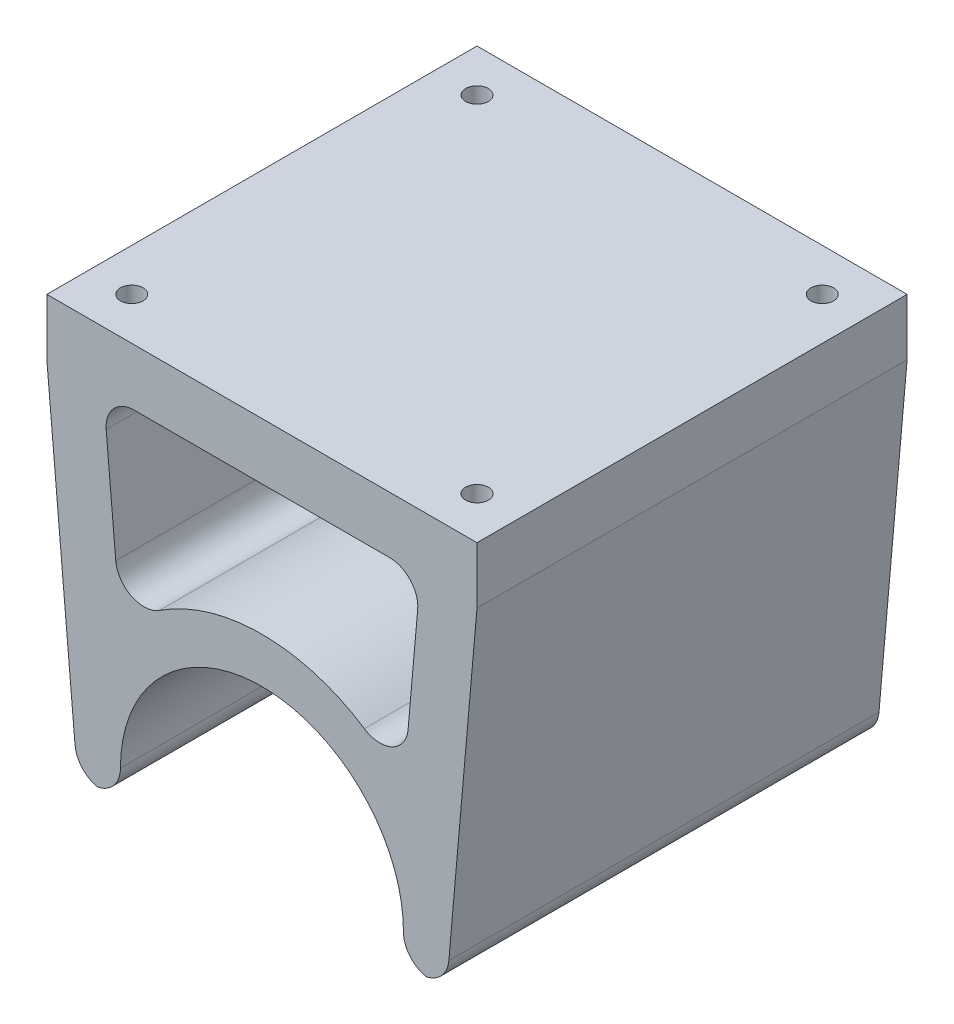
ISO-10303-21;
HEADER;
FILE_DESCRIPTION(('STEP AP214'),'2;1');
FILE_NAME('part.step','',(''),(''),'','','');
FILE_SCHEMA(('AUTOMOTIVE_DESIGN { 1 0 10303 214 1 1 1 1 }'));
ENDSEC;
DATA;
#1=APPLICATION_CONTEXT('core data for automotive mechanical design processes');
#2=APPLICATION_PROTOCOL_DEFINITION('international standard','automotive_design',2000,#1);
#3=PRODUCT_CONTEXT('',#1,'mechanical');
#4=PRODUCT('Part','Part','',(#3));
#5=PRODUCT_RELATED_PRODUCT_CATEGORY('part','',(#4));
#6=PRODUCT_DEFINITION_FORMATION('','',#4);
#7=PRODUCT_DEFINITION_CONTEXT('part definition',#1,'design');
#8=PRODUCT_DEFINITION('design','',#6,#7);
#9=PRODUCT_DEFINITION_SHAPE('','',#8);
#10=(LENGTH_UNIT() NAMED_UNIT(*) SI_UNIT(.MILLI.,.METRE.));
#11=(NAMED_UNIT(*) PLANE_ANGLE_UNIT() SI_UNIT($,.RADIAN.));
#12=(NAMED_UNIT(*) SI_UNIT($,.STERADIAN.) SOLID_ANGLE_UNIT());
#13=UNCERTAINTY_MEASURE_WITH_UNIT(LENGTH_MEASURE(1.E-05),#10,'distance_accuracy_value','');
#14=(GEOMETRIC_REPRESENTATION_CONTEXT(3) GLOBAL_UNCERTAINTY_ASSIGNED_CONTEXT((#13)) GLOBAL_UNIT_ASSIGNED_CONTEXT((#10,
#11,#12)) REPRESENTATION_CONTEXT('',''));
#15=CARTESIAN_POINT('',(0.,0.,0.));
#16=DIRECTION('',(0.,0.,1.));
#17=DIRECTION('',(1.,0.,0.));
#18=AXIS2_PLACEMENT_3D('',#15,#16,#17);
#19=CARTESIAN_POINT('',(0.,-28.,57.0788655293196));
#20=DIRECTION('',(0.,0.,-1.));
#21=DIRECTION('',(-1.,0.,0.));
#22=AXIS2_PLACEMENT_3D('',#19,#20,#21);
#23=CYLINDRICAL_SURFACE('',#22,16.5);
#24=CARTESIAN_POINT('',(0.,-28.,19.));
#25=DIRECTION('',(0.,0.,-1.));
#26=DIRECTION('',(-1.,0.,0.));
#27=AXIS2_PLACEMENT_3D('',#24,#25,#26);
#28=CIRCLE('',#27,16.5);
#29=CARTESIAN_POINT('',(-9.05046076724547,-14.2036541105787,19.));
#30=VERTEX_POINT('',#29);
#31=CARTESIAN_POINT('',(9.05046076724548,-14.2036541105787,19.));
#32=VERTEX_POINT('',#31);
#33=EDGE_CURVE('E359',#30,#32,#28,.T.);
#34=ORIENTED_EDGE('',*,*,#33,.T.);
#35=DIRECTION('',(0.,0.,-1.));
#36=VECTOR('',#35,1.);
#37=CARTESIAN_POINT('',(9.05046076724548,-14.2036541105787,57.0788655293196));
#38=LINE('',#37,#36);
#39=CARTESIAN_POINT('',(9.05046076724548,-14.2036541105787,-19.));
#40=VERTEX_POINT('',#39);
#41=EDGE_CURVE('E241',#32,#40,#38,.T.);
#42=ORIENTED_EDGE('',*,*,#41,.T.);
#43=CARTESIAN_POINT('',(0.,-28.,-19.));
#44=DIRECTION('',(0.,0.,1.));
#45=DIRECTION('',(1.,0.,0.));
#46=AXIS2_PLACEMENT_3D('',#43,#44,#45);
#47=CIRCLE('',#46,16.5);
#48=CARTESIAN_POINT('',(-9.05046076724547,-14.2036541105787,-19.));
#49=VERTEX_POINT('',#48);
#50=EDGE_CURVE('E352',#40,#49,#47,.T.);
#51=ORIENTED_EDGE('',*,*,#50,.T.);
#52=DIRECTION('',(0.,0.,-1.));
#53=VECTOR('',#52,1.);
#54=CARTESIAN_POINT('',(-9.05046076724547,-14.2036541105787,57.0788655293196));
#55=LINE('',#54,#53);
#56=EDGE_CURVE('E238',#49,#30,#55,.F.);
#57=ORIENTED_EDGE('',*,*,#56,.T.);
#58=EDGE_LOOP('',(#34,#42,#51,#57));
#59=FACE_BOUND('',#58,.T.);
#60=ADVANCED_FACE('F39',(#59),#23,.T.);
#61=CARTESIAN_POINT('',(-19.4376588699407,4.96139284015418,-50.1886965367356));
#62=DIRECTION('',(-0.996131802539622,-0.0878716789936535,0.));
#63=DIRECTION('',(0.0878716789936535,-0.996131802539622,0.));
#64=AXIS2_PLACEMENT_3D('',#61,#62,#63);
#65=PLANE('',#64);
#66=DIRECTION('',(-0.0878716789936535,0.996131802539622,0.));
#67=VECTOR('',#66,1.);
#68=CARTESIAN_POINT('',(-19.4376588699407,4.96139284015418,-19.));
#69=LINE('',#68,#67);
#70=CARTESIAN_POINT('',(-16.5106601501697,-28.2196791974841,-19.));
#71=VERTEX_POINT('',#70);
#72=CARTESIAN_POINT('',(-19.,0.,-19.));
#73=VERTEX_POINT('',#72);
#74=EDGE_CURVE('E277',#71,#73,#69,.T.);
#75=ORIENTED_EDGE('',*,*,#74,.F.);
#76=DIRECTION('',(0.,0.,-1.));
#77=VECTOR('',#76,1.);
#78=CARTESIAN_POINT('',(-16.5106601501697,-28.2196791974841,19.));
#79=LINE('',#78,#77);
#80=CARTESIAN_POINT('',(-16.5106601501697,-28.2196791974841,19.));
#81=VERTEX_POINT('',#80);
#82=EDGE_CURVE('E233',#71,#81,#79,.F.);
#83=ORIENTED_EDGE('',*,*,#82,.T.);
#84=DIRECTION('',(0.0878716789936535,-0.996131802539622,0.));
#85=VECTOR('',#84,1.);
#86=CARTESIAN_POINT('',(-19.4376588699407,4.96139284015418,19.));
#87=LINE('',#86,#85);
#88=CARTESIAN_POINT('',(-19.,0.,19.));
#89=VERTEX_POINT('',#88);
#90=EDGE_CURVE('E296',#89,#81,#87,.T.);
#91=ORIENTED_EDGE('',*,*,#90,.F.);
#92=DIRECTION('',(0.,0.,1.));
#93=VECTOR('',#92,1.);
#94=CARTESIAN_POINT('',(-19.,0.,-19.));
#95=LINE('',#94,#93);
#96=EDGE_CURVE('E286',#73,#89,#95,.T.);
#97=ORIENTED_EDGE('',*,*,#96,.F.);
#98=EDGE_LOOP('',(#75,#83,#91,#97));
#99=FACE_BOUND('',#98,.T.);
#100=ADVANCED_FACE('F282',(#99),#65,.T.);
#101=CARTESIAN_POINT('',(0.,0.,0.));
#102=DIRECTION('',(0.,1.,0.));
#103=DIRECTION('',(0.,0.,1.));
#104=AXIS2_PLACEMENT_3D('',#101,#102,#103);
#105=PLANE('',#104);
#106=DIRECTION('',(-1.,0.,0.));
#107=VECTOR('',#106,1.);
#108=CARTESIAN_POINT('',(-19.,0.,-19.));
#109=LINE('',#108,#107);
#110=CARTESIAN_POINT('',(11.2697596938976,0.,-19.));
#111=VERTEX_POINT('',#110);
#112=CARTESIAN_POINT('',(-11.2697596938976,0.,-19.));
#113=VERTEX_POINT('',#112);
#114=EDGE_CURVE('E178',#111,#113,#109,.T.);
#115=ORIENTED_EDGE('',*,*,#114,.F.);
#116=DIRECTION('',(0.,0.,1.));
#117=VECTOR('',#116,1.);
#118=CARTESIAN_POINT('',(11.2697596938976,0.,19.));
#119=LINE('',#118,#117);
#120=CARTESIAN_POINT('',(11.2697596938976,0.,19.));
#121=VERTEX_POINT('',#120);
#122=EDGE_CURVE('E249',#111,#121,#119,.T.);
#123=ORIENTED_EDGE('',*,*,#122,.T.);
#124=DIRECTION('',(1.,0.,0.));
#125=VECTOR('',#124,1.);
#126=CARTESIAN_POINT('',(-19.,0.,19.));
#127=LINE('',#126,#125);
#128=CARTESIAN_POINT('',(-11.2697596938976,0.,19.));
#129=VERTEX_POINT('',#128);
#130=EDGE_CURVE('E202',#129,#121,#127,.T.);
#131=ORIENTED_EDGE('',*,*,#130,.F.);
#132=DIRECTION('',(0.,0.,1.));
#133=VECTOR('',#132,1.);
#134=CARTESIAN_POINT('',(-11.2697596938976,0.,0.));
#135=LINE('',#134,#133);
#136=EDGE_CURVE('E247',#129,#113,#135,.F.);
#137=ORIENTED_EDGE('',*,*,#136,.T.);
#138=EDGE_LOOP('',(#115,#123,#131,#137));
#139=FACE_BOUND('',#138,.T.);
#140=ADVANCED_FACE('F337',(#139),#105,.F.);
#141=CARTESIAN_POINT('',(19.,5.,-19.));
#142=DIRECTION('',(-1.,0.,0.));
#143=DIRECTION('',(0.,0.,1.));
#144=AXIS2_PLACEMENT_3D('',#141,#142,#143);
#145=PLANE('',#144);
#146=DIRECTION('',(0.,0.,-1.));
#147=VECTOR('',#146,1.);
#148=CARTESIAN_POINT('',(19.,0.,-19.));
#149=LINE('',#148,#147);
#150=CARTESIAN_POINT('',(19.,0.,19.));
#151=VERTEX_POINT('',#150);
#152=CARTESIAN_POINT('',(19.,0.,-19.));
#153=VERTEX_POINT('',#152);
#154=EDGE_CURVE('E168',#151,#153,#149,.T.);
#155=ORIENTED_EDGE('',*,*,#154,.T.);
#156=DIRECTION('',(0.,-1.,0.));
#157=VECTOR('',#156,1.);
#158=CARTESIAN_POINT('',(19.,5.,-19.));
#159=LINE('',#158,#157);
#160=CARTESIAN_POINT('',(19.,5.,-19.));
#161=VERTEX_POINT('',#160);
#162=EDGE_CURVE('E209',#161,#153,#159,.T.);
#163=ORIENTED_EDGE('',*,*,#162,.F.);
#164=DIRECTION('',(0.,0.,-1.));
#165=VECTOR('',#164,1.);
#166=CARTESIAN_POINT('',(19.,5.,-19.));
#167=LINE('',#166,#165);
#168=CARTESIAN_POINT('',(19.,5.,19.));
#169=VERTEX_POINT('',#168);
#170=EDGE_CURVE('E193',#169,#161,#167,.T.);
#171=ORIENTED_EDGE('',*,*,#170,.F.);
#172=DIRECTION('',(0.,-1.,0.));
#173=VECTOR('',#172,1.);
#174=CARTESIAN_POINT('',(19.,5.,19.));
#175=LINE('',#174,#173);
#176=EDGE_CURVE('E184',#169,#151,#175,.T.);
#177=ORIENTED_EDGE('',*,*,#176,.T.);
#178=EDGE_LOOP('',(#155,#163,#171,#177));
#179=FACE_BOUND('',#178,.T.);
#180=ADVANCED_FACE('F191',(#179),#145,.F.);
#181=CARTESIAN_POINT('',(-19.,5.,-19.));
#182=DIRECTION('',(0.,0.,1.));
#183=DIRECTION('',(1.,0.,0.));
#184=AXIS2_PLACEMENT_3D('',#181,#182,#183);
#185=PLANE('',#184);
#186=DIRECTION('',(-0.0878716789936535,-0.996131802539622,0.));
#187=VECTOR('',#186,1.);
#188=CARTESIAN_POINT('',(14.1828516149583,2.07284429854586,-19.));
#189=LINE('',#188,#187);
#190=CARTESIAN_POINT('',(13.7600892002466,-2.71967919748414,-19.));
#191=VERTEX_POINT('',#190);
#192=CARTESIAN_POINT('',(12.9120722080257,-12.3329778702718,-19.));
#193=VERTEX_POINT('',#192);
#194=EDGE_CURVE('E366',#191,#193,#189,.T.);
#195=ORIENTED_EDGE('',*,*,#194,.F.);
#196=CARTESIAN_POINT('',(11.2697596938976,-2.5,-19.));
#197=DIRECTION('',(0.,0.,1.));
#198=DIRECTION('',(1.,0.,0.));
#199=AXIS2_PLACEMENT_3D('',#196,#197,#198);
#200=CIRCLE('',#199,2.5);
#201=EDGE_CURVE('E263',#191,#111,#200,.T.);
#202=ORIENTED_EDGE('',*,*,#201,.T.);
#203=ORIENTED_EDGE('',*,*,#114,.T.);
#204=CARTESIAN_POINT('',(-11.2697596938976,-2.5,-19.));
#205=DIRECTION('',(0.,0.,1.));
#206=DIRECTION('',(1.,0.,0.));
#207=AXIS2_PLACEMENT_3D('',#204,#205,#206);
#208=CIRCLE('',#207,2.5);
#209=CARTESIAN_POINT('',(-13.7600892002466,-2.71967919748413,-19.));
#210=VERTEX_POINT('',#209);
#211=EDGE_CURVE('E11',#113,#210,#208,.T.);
#212=ORIENTED_EDGE('',*,*,#211,.T.);
#213=DIRECTION('',(0.0878716789936535,-0.996131802539622,0.));
#214=VECTOR('',#213,1.);
#215=CARTESIAN_POINT('',(-14.4762660297865,5.39905171009484,-19.));
#216=LINE('',#215,#214);
#217=CARTESIAN_POINT('',(-12.9120722080257,-12.3329778702718,-19.));
#218=VERTEX_POINT('',#217);
#219=EDGE_CURVE('E288',#210,#218,#216,.T.);
#220=ORIENTED_EDGE('',*,*,#219,.T.);
#221=CARTESIAN_POINT('',(-10.4217427016766,-12.1132986727877,-19.));
#222=DIRECTION('',(0.,0.,1.));
#223=DIRECTION('',(1.,0.,0.));
#224=AXIS2_PLACEMENT_3D('',#221,#222,#223);
#225=CIRCLE('',#224,2.5);
#226=EDGE_CURVE('E258',#218,#49,#225,.T.);
#227=ORIENTED_EDGE('',*,*,#226,.T.);
#228=ORIENTED_EDGE('',*,*,#50,.F.);
#229=CARTESIAN_POINT('',(10.4217427016766,-12.1132986727877,-19.));
#230=DIRECTION('',(0.,0.,1.));
#231=DIRECTION('',(1.,0.,0.));
#232=AXIS2_PLACEMENT_3D('',#229,#230,#231);
#233=CIRCLE('',#232,2.5);
#234=EDGE_CURVE('E253',#40,#193,#233,.T.);
#235=ORIENTED_EDGE('',*,*,#234,.T.);
#236=EDGE_LOOP('',(#195,#202,#203,#212,#220,#227,#228,#235));
#237=FACE_BOUND('',#236,.T.);
#238=DIRECTION('',(0.0878716789936535,0.996131802539622,0.));
#239=VECTOR('',#238,1.);
#240=CARTESIAN_POINT('',(19.1442444551124,1.6351854286052,-19.));
#241=LINE('',#240,#239);
#242=CARTESIAN_POINT('',(16.5106601501697,-28.2196791974841,-19.));
#243=VERTEX_POINT('',#242);
#244=EDGE_CURVE('E173',#243,#153,#241,.T.);
#245=ORIENTED_EDGE('',*,*,#244,.F.);
#246=CARTESIAN_POINT('',(14.0203306438206,-28.,-19.));
#247=DIRECTION('',(0.,0.,1.));
#248=DIRECTION('',(1.,0.,0.));
#249=AXIS2_PLACEMENT_3D('',#246,#247,#248);
#250=CIRCLE('',#249,2.5);
#251=CARTESIAN_POINT('',(14.5101653219103,-30.4515427771387,-19.));
#252=VERTEX_POINT('',#251);
#253=EDGE_CURVE('E217',#243,#252,#250,.F.);
#254=ORIENTED_EDGE('',*,*,#253,.T.);
#255=CARTESIAN_POINT('',(15.,-28.,-19.));
#256=DIRECTION('',(0.,0.,1.));
#257=DIRECTION('',(1.,0.,0.));
#258=AXIS2_PLACEMENT_3D('',#255,#256,#257);
#259=CIRCLE('',#258,2.5);
#260=CARTESIAN_POINT('',(12.5,-28.,-19.));
#261=VERTEX_POINT('',#260);
#262=EDGE_CURVE('E220',#252,#261,#259,.F.);
#263=ORIENTED_EDGE('',*,*,#262,.T.);
#264=CARTESIAN_POINT('',(0.,-28.,-19.));
#265=DIRECTION('',(0.,0.,1.));
#266=DIRECTION('',(1.,0.,0.));
#267=AXIS2_PLACEMENT_3D('',#264,#265,#266);
#268=CIRCLE('',#267,12.5);
#269=CARTESIAN_POINT('',(-12.5,-28.,-19.));
#270=VERTEX_POINT('',#269);
#271=EDGE_CURVE('E363',#261,#270,#268,.T.);
#272=ORIENTED_EDGE('',*,*,#271,.T.);
#273=CARTESIAN_POINT('',(-15.,-28.,-19.));
#274=DIRECTION('',(0.,0.,1.));
#275=DIRECTION('',(1.,0.,0.));
#276=AXIS2_PLACEMENT_3D('',#273,#274,#275);
#277=CIRCLE('',#276,2.5);
#278=CARTESIAN_POINT('',(-14.5101653219103,-30.4515427771387,-19.));
#279=VERTEX_POINT('',#278);
#280=EDGE_CURVE('E212',#270,#279,#277,.F.);
#281=ORIENTED_EDGE('',*,*,#280,.T.);
#282=CARTESIAN_POINT('',(-14.0203306438206,-28.,-19.));
#283=DIRECTION('',(0.,0.,1.));
#284=DIRECTION('',(1.,0.,0.));
#285=AXIS2_PLACEMENT_3D('',#282,#283,#284);
#286=CIRCLE('',#285,2.5);
#287=EDGE_CURVE('E215',#279,#71,#286,.F.);
#288=ORIENTED_EDGE('',*,*,#287,.T.);
#289=ORIENTED_EDGE('',*,*,#74,.T.);
#290=DIRECTION('',(0.,-1.,0.));
#291=VECTOR('',#290,1.);
#292=CARTESIAN_POINT('',(-19.,5.,-19.));
#293=LINE('',#292,#291);
#294=CARTESIAN_POINT('',(-19.,5.,-19.));
#295=VERTEX_POINT('',#294);
#296=EDGE_CURVE('E197',#295,#73,#293,.T.);
#297=ORIENTED_EDGE('',*,*,#296,.F.);
#298=DIRECTION('',(-1.,0.,0.));
#299=VECTOR('',#298,1.);
#300=CARTESIAN_POINT('',(-19.,5.,-19.));
#301=LINE('',#300,#299);
#302=EDGE_CURVE('E325',#161,#295,#301,.T.);
#303=ORIENTED_EDGE('',*,*,#302,.F.);
#304=ORIENTED_EDGE('',*,*,#162,.T.);
#305=EDGE_LOOP('',(#245,#254,#263,#272,#281,#288,#289,#297,#303,#304));
#306=FACE_BOUND('',#305,.T.);
#307=ADVANCED_FACE('F280',(#237,#306),#185,.F.);
#308=CARTESIAN_POINT('',(-19.,5.,-19.));
#309=DIRECTION('',(1.,0.,0.));
#310=DIRECTION('',(0.,0.,-1.));
#311=AXIS2_PLACEMENT_3D('',#308,#309,#310);
#312=PLANE('',#311);
#313=ORIENTED_EDGE('',*,*,#96,.T.);
#314=DIRECTION('',(0.,-1.,0.));
#315=VECTOR('',#314,1.);
#316=CARTESIAN_POINT('',(-19.,5.,19.));
#317=LINE('',#316,#315);
#318=CARTESIAN_POINT('',(-19.,5.,19.));
#319=VERTEX_POINT('',#318);
#320=EDGE_CURVE('E192',#319,#89,#317,.T.);
#321=ORIENTED_EDGE('',*,*,#320,.F.);
#322=DIRECTION('',(0.,0.,1.));
#323=VECTOR('',#322,1.);
#324=CARTESIAN_POINT('',(-19.,5.,-19.));
#325=LINE('',#324,#323);
#326=EDGE_CURVE('E201',#295,#319,#325,.T.);
#327=ORIENTED_EDGE('',*,*,#326,.F.);
#328=ORIENTED_EDGE('',*,*,#296,.T.);
#329=EDGE_LOOP('',(#313,#321,#327,#328));
#330=FACE_BOUND('',#329,.T.);
#331=ADVANCED_FACE('F427',(#330),#312,.F.);
#332=CARTESIAN_POINT('',(-19.,5.,19.));
#333=DIRECTION('',(0.,0.,-1.));
#334=DIRECTION('',(-1.,0.,0.));
#335=AXIS2_PLACEMENT_3D('',#332,#333,#334);
#336=PLANE('',#335);
#337=CARTESIAN_POINT('',(15.,-28.,19.));
#338=DIRECTION('',(0.,0.,-1.));
#339=DIRECTION('',(-1.,0.,0.));
#340=AXIS2_PLACEMENT_3D('',#337,#338,#339);
#341=CIRCLE('',#340,2.5);
#342=CARTESIAN_POINT('',(12.5,-28.,19.));
#343=VERTEX_POINT('',#342);
#344=CARTESIAN_POINT('',(14.5101653219103,-30.4515427771387,19.));
#345=VERTEX_POINT('',#344);
#346=EDGE_CURVE('E57',#343,#345,#341,.F.);
#347=ORIENTED_EDGE('',*,*,#346,.T.);
#348=CARTESIAN_POINT('',(14.0203306438206,-28.,19.));
#349=DIRECTION('',(0.,0.,-1.));
#350=DIRECTION('',(-1.,0.,0.));
#351=AXIS2_PLACEMENT_3D('',#348,#349,#350);
#352=CIRCLE('',#351,2.5);
#353=CARTESIAN_POINT('',(16.5106601501697,-28.2196791974841,19.));
#354=VERTEX_POINT('',#353);
#355=EDGE_CURVE('E189',#345,#354,#352,.F.);
#356=ORIENTED_EDGE('',*,*,#355,.T.);
#357=DIRECTION('',(-0.0878716789936535,-0.996131802539622,0.));
#358=VECTOR('',#357,1.);
#359=CARTESIAN_POINT('',(19.1442444551124,1.6351854286052,19.));
#360=LINE('',#359,#358);
#361=EDGE_CURVE('E167',#151,#354,#360,.T.);
#362=ORIENTED_EDGE('',*,*,#361,.F.);
#363=ORIENTED_EDGE('',*,*,#176,.F.);
#364=DIRECTION('',(1.,0.,0.));
#365=VECTOR('',#364,1.);
#366=CARTESIAN_POINT('',(-19.,5.,19.));
#367=LINE('',#366,#365);
#368=EDGE_CURVE('E196',#319,#169,#367,.T.);
#369=ORIENTED_EDGE('',*,*,#368,.F.);
#370=ORIENTED_EDGE('',*,*,#320,.T.);
#371=ORIENTED_EDGE('',*,*,#90,.T.);
#372=CARTESIAN_POINT('',(-14.0203306438206,-28.,19.));
#373=DIRECTION('',(0.,0.,-1.));
#374=DIRECTION('',(-1.,0.,0.));
#375=AXIS2_PLACEMENT_3D('',#372,#373,#374);
#376=CIRCLE('',#375,2.5);
#377=CARTESIAN_POINT('',(-14.5101653219103,-30.4515427771387,19.));
#378=VERTEX_POINT('',#377);
#379=EDGE_CURVE('E65',#81,#378,#376,.F.);
#380=ORIENTED_EDGE('',*,*,#379,.T.);
#381=CARTESIAN_POINT('',(-15.,-28.,19.));
#382=DIRECTION('',(0.,0.,-1.));
#383=DIRECTION('',(-1.,0.,0.));
#384=AXIS2_PLACEMENT_3D('',#381,#382,#383);
#385=CIRCLE('',#384,2.5);
#386=CARTESIAN_POINT('',(-12.5,-28.,19.));
#387=VERTEX_POINT('',#386);
#388=EDGE_CURVE('E225',#378,#387,#385,.F.);
#389=ORIENTED_EDGE('',*,*,#388,.T.);
#390=CARTESIAN_POINT('',(0.,-28.,19.));
#391=DIRECTION('',(0.,0.,-1.));
#392=DIRECTION('',(-1.,0.,0.));
#393=AXIS2_PLACEMENT_3D('',#390,#391,#392);
#394=CIRCLE('',#393,12.5);
#395=EDGE_CURVE('E297',#387,#343,#394,.T.);
#396=ORIENTED_EDGE('',*,*,#395,.T.);
#397=EDGE_LOOP('',(#347,#356,#362,#363,#369,#370,#371,#380,#389,#396));
#398=FACE_BOUND('',#397,.T.);
#399=DIRECTION('',(-0.0878716789936535,0.996131802539622,0.));
#400=VECTOR('',#399,1.);
#401=CARTESIAN_POINT('',(-14.4762660297865,5.39905171009484,19.));
#402=LINE('',#401,#400);
#403=CARTESIAN_POINT('',(-12.9120722080257,-12.3329778702718,19.));
#404=VERTEX_POINT('',#403);
#405=CARTESIAN_POINT('',(-13.7600892002466,-2.71967919748414,19.));
#406=VERTEX_POINT('',#405);
#407=EDGE_CURVE('E295',#404,#406,#402,.T.);
#408=ORIENTED_EDGE('',*,*,#407,.T.);
#409=CARTESIAN_POINT('',(-11.2697596938976,-2.5,19.));
#410=DIRECTION('',(0.,0.,-1.));
#411=DIRECTION('',(-1.,0.,0.));
#412=AXIS2_PLACEMENT_3D('',#409,#410,#411);
#413=CIRCLE('',#412,2.5);
#414=EDGE_CURVE('E48',#406,#129,#413,.T.);
#415=ORIENTED_EDGE('',*,*,#414,.T.);
#416=ORIENTED_EDGE('',*,*,#130,.T.);
#417=CARTESIAN_POINT('',(11.2697596938976,-2.5,19.));
#418=DIRECTION('',(0.,0.,-1.));
#419=DIRECTION('',(-1.,0.,0.));
#420=AXIS2_PLACEMENT_3D('',#417,#418,#419);
#421=CIRCLE('',#420,2.5);
#422=CARTESIAN_POINT('',(13.7600892002466,-2.71967919748414,19.));
#423=VERTEX_POINT('',#422);
#424=EDGE_CURVE('E261',#121,#423,#421,.T.);
#425=ORIENTED_EDGE('',*,*,#424,.T.);
#426=DIRECTION('',(0.0878716789936535,0.996131802539622,0.));
#427=VECTOR('',#426,1.);
#428=CARTESIAN_POINT('',(14.1828516149583,2.07284429854586,19.));
#429=LINE('',#428,#427);
#430=CARTESIAN_POINT('',(12.9120722080257,-12.3329778702718,19.));
#431=VERTEX_POINT('',#430);
#432=EDGE_CURVE('E186',#431,#423,#429,.T.);
#433=ORIENTED_EDGE('',*,*,#432,.F.);
#434=CARTESIAN_POINT('',(10.4217427016766,-12.1132986727877,19.));
#435=DIRECTION('',(0.,0.,-1.));
#436=DIRECTION('',(-1.,0.,0.));
#437=AXIS2_PLACEMENT_3D('',#434,#435,#436);
#438=CIRCLE('',#437,2.5);
#439=EDGE_CURVE('E254',#431,#32,#438,.T.);
#440=ORIENTED_EDGE('',*,*,#439,.T.);
#441=ORIENTED_EDGE('',*,*,#33,.F.);
#442=CARTESIAN_POINT('',(-10.4217427016766,-12.1132986727877,19.));
#443=DIRECTION('',(0.,0.,-1.));
#444=DIRECTION('',(-1.,0.,0.));
#445=AXIS2_PLACEMENT_3D('',#442,#443,#444);
#446=CIRCLE('',#445,2.5);
#447=EDGE_CURVE('E256',#30,#404,#446,.T.);
#448=ORIENTED_EDGE('',*,*,#447,.T.);
#449=EDGE_LOOP('',(#408,#415,#416,#425,#433,#440,#441,#448));
#450=FACE_BOUND('',#449,.T.);
#451=ADVANCED_FACE('F185',(#398,#450),#336,.F.);
#452=CARTESIAN_POINT('',(0.,5.,0.));
#453=DIRECTION('',(0.,1.,0.));
#454=DIRECTION('',(0.,0.,1.));
#455=AXIS2_PLACEMENT_3D('',#452,#453,#454);
#456=PLANE('',#455);
#457=CARTESIAN_POINT('',(-15.25,5.,-15.25));
#458=DIRECTION('',(0.,1.,0.));
#459=DIRECTION('',(0.,0.,1.));
#460=AXIS2_PLACEMENT_3D('',#457,#458,#459);
#461=CIRCLE('',#460,0.999999999999999);
#462=CARTESIAN_POINT('',(-15.25,5.,-14.25));
#463=VERTEX_POINT('',#462);
#464=EDGE_CURVE('E290',#463,#463,#461,.T.);
#465=ORIENTED_EDGE('',*,*,#464,.F.);
#466=EDGE_LOOP('',(#465));
#467=FACE_BOUND('',#466,.T.);
#468=CARTESIAN_POINT('',(15.25,5.,-15.25));
#469=DIRECTION('',(0.,1.,0.));
#470=DIRECTION('',(0.,0.,1.));
#471=AXIS2_PLACEMENT_3D('',#468,#469,#470);
#472=CIRCLE('',#471,1.);
#473=CARTESIAN_POINT('',(15.25,5.,-14.25));
#474=VERTEX_POINT('',#473);
#475=EDGE_CURVE('E304',#474,#474,#472,.T.);
#476=ORIENTED_EDGE('',*,*,#475,.F.);
#477=EDGE_LOOP('',(#476));
#478=FACE_BOUND('',#477,.T.);
#479=CARTESIAN_POINT('',(15.25,5.,15.25));
#480=DIRECTION('',(0.,1.,0.));
#481=DIRECTION('',(0.,0.,1.));
#482=AXIS2_PLACEMENT_3D('',#479,#480,#481);
#483=CIRCLE('',#482,1.);
#484=CARTESIAN_POINT('',(15.25,5.,16.25));
#485=VERTEX_POINT('',#484);
#486=EDGE_CURVE('E311',#485,#485,#483,.T.);
#487=ORIENTED_EDGE('',*,*,#486,.F.);
#488=EDGE_LOOP('',(#487));
#489=FACE_BOUND('',#488,.T.);
#490=CARTESIAN_POINT('',(-15.25,5.,15.25));
#491=DIRECTION('',(0.,1.,0.));
#492=DIRECTION('',(0.,0.,1.));
#493=AXIS2_PLACEMENT_3D('',#490,#491,#492);
#494=CIRCLE('',#493,0.999999999999999);
#495=CARTESIAN_POINT('',(-15.25,5.,16.25));
#496=VERTEX_POINT('',#495);
#497=EDGE_CURVE('E320',#496,#496,#494,.T.);
#498=ORIENTED_EDGE('',*,*,#497,.F.);
#499=EDGE_LOOP('',(#498));
#500=FACE_BOUND('',#499,.T.);
#501=ORIENTED_EDGE('',*,*,#170,.T.);
#502=ORIENTED_EDGE('',*,*,#302,.T.);
#503=ORIENTED_EDGE('',*,*,#326,.T.);
#504=ORIENTED_EDGE('',*,*,#368,.T.);
#505=EDGE_LOOP('',(#501,#502,#503,#504));
#506=FACE_BOUND('',#505,.T.);
#507=ADVANCED_FACE('F423',(#467,#478,#489,#500,#506),#456,.T.);
#508=CARTESIAN_POINT('',(-15.25,5.,15.25));
#509=DIRECTION('',(0.,1.,0.));
#510=DIRECTION('',(0.,0.,1.));
#511=AXIS2_PLACEMENT_3D('',#508,#509,#510);
#512=CYLINDRICAL_SURFACE('',#511,0.999999999999999);
#513=CARTESIAN_POINT('',(-15.25,0.,15.25));
#514=DIRECTION('',(0.,1.,0.));
#515=DIRECTION('',(0.,0.,1.));
#516=AXIS2_PLACEMENT_3D('',#513,#514,#515);
#517=CIRCLE('',#516,0.999999999999999);
#518=CARTESIAN_POINT('',(-15.25,0.,16.25));
#519=VERTEX_POINT('',#518);
#520=EDGE_CURVE('E177',#519,#519,#517,.T.);
#521=ORIENTED_EDGE('',*,*,#520,.F.);
#522=EDGE_LOOP('',(#521));
#523=FACE_BOUND('',#522,.T.);
#524=ORIENTED_EDGE('',*,*,#497,.T.);
#525=EDGE_LOOP('',(#524));
#526=FACE_BOUND('',#525,.T.);
#527=ADVANCED_FACE('F420',(#523,#526),#512,.F.);
#528=CARTESIAN_POINT('',(15.25,5.,15.25));
#529=DIRECTION('',(0.,1.,0.));
#530=DIRECTION('',(0.,0.,1.));
#531=AXIS2_PLACEMENT_3D('',#528,#529,#530);
#532=CYLINDRICAL_SURFACE('',#531,0.999999999999999);
#533=CARTESIAN_POINT('',(15.25,0.,15.25));
#534=DIRECTION('',(0.,1.,0.));
#535=DIRECTION('',(0.,0.,1.));
#536=AXIS2_PLACEMENT_3D('',#533,#534,#535);
#537=CIRCLE('',#536,0.999999999999997);
#538=CARTESIAN_POINT('',(15.25,0.,16.25));
#539=VERTEX_POINT('',#538);
#540=EDGE_CURVE('E313',#539,#539,#537,.T.);
#541=ORIENTED_EDGE('',*,*,#540,.F.);
#542=EDGE_LOOP('',(#541));
#543=FACE_BOUND('',#542,.T.);
#544=ORIENTED_EDGE('',*,*,#486,.T.);
#545=EDGE_LOOP('',(#544));
#546=FACE_BOUND('',#545,.T.);
#547=ADVANCED_FACE('F413',(#543,#546),#532,.F.);
#548=CARTESIAN_POINT('',(15.25,5.,-15.25));
#549=DIRECTION('',(0.,1.,0.));
#550=DIRECTION('',(0.,0.,1.));
#551=AXIS2_PLACEMENT_3D('',#548,#549,#550);
#552=CYLINDRICAL_SURFACE('',#551,0.999999999999999);
#553=CARTESIAN_POINT('',(15.25,0.,-15.25));
#554=DIRECTION('',(0.,1.,0.));
#555=DIRECTION('',(0.,0.,1.));
#556=AXIS2_PLACEMENT_3D('',#553,#554,#555);
#557=CIRCLE('',#556,0.999999999999997);
#558=CARTESIAN_POINT('',(15.25,0.,-14.25));
#559=VERTEX_POINT('',#558);
#560=EDGE_CURVE('E308',#559,#559,#557,.T.);
#561=ORIENTED_EDGE('',*,*,#560,.F.);
#562=EDGE_LOOP('',(#561));
#563=FACE_BOUND('',#562,.T.);
#564=ORIENTED_EDGE('',*,*,#475,.T.);
#565=EDGE_LOOP('',(#564));
#566=FACE_BOUND('',#565,.T.);
#567=ADVANCED_FACE('F408',(#563,#566),#552,.F.);
#568=CARTESIAN_POINT('',(-15.25,5.,-15.25));
#569=DIRECTION('',(0.,1.,0.));
#570=DIRECTION('',(0.,0.,1.));
#571=AXIS2_PLACEMENT_3D('',#568,#569,#570);
#572=CYLINDRICAL_SURFACE('',#571,0.999999999999999);
#573=CARTESIAN_POINT('',(-15.25,0.,-15.25));
#574=DIRECTION('',(0.,1.,0.));
#575=DIRECTION('',(0.,0.,1.));
#576=AXIS2_PLACEMENT_3D('',#573,#574,#575);
#577=CIRCLE('',#576,0.999999999999999);
#578=CARTESIAN_POINT('',(-15.25,0.,-14.25));
#579=VERTEX_POINT('',#578);
#580=EDGE_CURVE('E293',#579,#579,#577,.T.);
#581=ORIENTED_EDGE('',*,*,#580,.F.);
#582=EDGE_LOOP('',(#581));
#583=FACE_BOUND('',#582,.T.);
#584=ORIENTED_EDGE('',*,*,#464,.T.);
#585=EDGE_LOOP('',(#584));
#586=FACE_BOUND('',#585,.T.);
#587=ADVANCED_FACE('F403',(#583,#586),#572,.F.);
#588=CARTESIAN_POINT('',(-14.4762660297865,5.39905171009484,-50.1886965367356));
#589=DIRECTION('',(0.996131802539622,0.0878716789936535,0.));
#590=DIRECTION('',(-0.0878716789936535,0.996131802539622,0.));
#591=AXIS2_PLACEMENT_3D('',#588,#589,#590);
#592=PLANE('',#591);
#593=ORIENTED_EDGE('',*,*,#407,.F.);
#594=DIRECTION('',(0.,0.,-1.));
#595=VECTOR('',#594,1.);
#596=CARTESIAN_POINT('',(-12.9120722080257,-12.3329778702718,-50.1886965367356));
#597=LINE('',#596,#595);
#598=EDGE_CURVE('E246',#404,#218,#597,.T.);
#599=ORIENTED_EDGE('',*,*,#598,.T.);
#600=ORIENTED_EDGE('',*,*,#219,.F.);
#601=DIRECTION('',(0.,0.,1.));
#602=VECTOR('',#601,1.);
#603=CARTESIAN_POINT('',(-13.7600892002466,-2.71967919748413,-50.1886965367356));
#604=LINE('',#603,#602);
#605=EDGE_CURVE('E243',#210,#406,#604,.T.);
#606=ORIENTED_EDGE('',*,*,#605,.T.);
#607=EDGE_LOOP('',(#593,#599,#600,#606));
#608=FACE_BOUND('',#607,.T.);
#609=ADVANCED_FACE('F350',(#608),#592,.T.);
#610=CARTESIAN_POINT('',(-19.,0.,-50.1886965367356));
#611=DIRECTION('',(0.,1.,0.));
#612=DIRECTION('',(0.,0.,1.));
#613=AXIS2_PLACEMENT_3D('',#610,#611,#612);
#614=PLANE('',#613);
#615=ORIENTED_EDGE('',*,*,#520,.T.);
#616=EDGE_LOOP('',(#615));
#617=FACE_BOUND('',#616,.T.);
#618=ADVANCED_FACE('F399',(#617),#614,.T.);
#619=ORIENTED_EDGE('',*,*,#580,.T.);
#620=EDGE_LOOP('',(#619));
#621=FACE_BOUND('',#620,.T.);
#622=ADVANCED_FACE('F398',(#621),#614,.T.);
#623=CARTESIAN_POINT('',(0.,-28.,57.0788655293196));
#624=DIRECTION('',(0.,0.,-1.));
#625=DIRECTION('',(-1.,0.,0.));
#626=AXIS2_PLACEMENT_3D('',#623,#624,#625);
#627=CYLINDRICAL_SURFACE('',#626,12.5);
#628=ORIENTED_EDGE('',*,*,#271,.F.);
#629=DIRECTION('',(0.,0.,-1.));
#630=VECTOR('',#629,1.);
#631=CARTESIAN_POINT('',(12.5,-28.,57.0788655293196));
#632=LINE('',#631,#630);
#633=EDGE_CURVE('E230',#261,#343,#632,.F.);
#634=ORIENTED_EDGE('',*,*,#633,.T.);
#635=ORIENTED_EDGE('',*,*,#395,.F.);
#636=DIRECTION('',(0.,0.,-1.));
#637=VECTOR('',#636,1.);
#638=CARTESIAN_POINT('',(-12.5,-28.,57.0788655293196));
#639=LINE('',#638,#637);
#640=EDGE_CURVE('E228',#387,#270,#639,.T.);
#641=ORIENTED_EDGE('',*,*,#640,.T.);
#642=EDGE_LOOP('',(#628,#634,#635,#641));
#643=FACE_BOUND('',#642,.T.);
#644=ADVANCED_FACE('F394',(#643),#627,.F.);
#645=CARTESIAN_POINT('',(19.1442444551124,1.6351854286052,-50.1886965367357));
#646=DIRECTION('',(-0.996131802539622,0.0878716789936535,0.));
#647=DIRECTION('',(-0.0878716789936535,-0.996131802539622,0.));
#648=AXIS2_PLACEMENT_3D('',#645,#646,#647);
#649=PLANE('',#648);
#650=ORIENTED_EDGE('',*,*,#361,.T.);
#651=DIRECTION('',(0.,0.,-1.));
#652=VECTOR('',#651,1.);
#653=CARTESIAN_POINT('',(16.5106601501697,-28.2196791974841,-50.1886965367357));
#654=LINE('',#653,#652);
#655=EDGE_CURVE('E214',#354,#243,#654,.T.);
#656=ORIENTED_EDGE('',*,*,#655,.T.);
#657=ORIENTED_EDGE('',*,*,#244,.T.);
#658=ORIENTED_EDGE('',*,*,#154,.F.);
#659=EDGE_LOOP('',(#650,#656,#657,#658));
#660=FACE_BOUND('',#659,.T.);
#661=ADVANCED_FACE('F166',(#660),#649,.F.);
#662=CARTESIAN_POINT('',(14.1828516149583,2.07284429854586,-50.1886965367357));
#663=DIRECTION('',(0.996131802539622,-0.0878716789936535,0.));
#664=DIRECTION('',(0.0878716789936535,0.996131802539622,0.));
#665=AXIS2_PLACEMENT_3D('',#662,#663,#664);
#666=PLANE('',#665);
#667=ORIENTED_EDGE('',*,*,#194,.T.);
#668=DIRECTION('',(0.,0.,1.));
#669=VECTOR('',#668,1.);
#670=CARTESIAN_POINT('',(12.9120722080257,-12.3329778702718,19.));
#671=LINE('',#670,#669);
#672=EDGE_CURVE('E232',#193,#431,#671,.T.);
#673=ORIENTED_EDGE('',*,*,#672,.T.);
#674=ORIENTED_EDGE('',*,*,#432,.T.);
#675=DIRECTION('',(0.,0.,1.));
#676=VECTOR('',#675,1.);
#677=CARTESIAN_POINT('',(13.7600892002466,-2.71967919748413,-19.));
#678=LINE('',#677,#676);
#679=EDGE_CURVE('E231',#423,#191,#678,.F.);
#680=ORIENTED_EDGE('',*,*,#679,.T.);
#681=EDGE_LOOP('',(#667,#673,#674,#680));
#682=FACE_BOUND('',#681,.T.);
#683=ADVANCED_FACE('F375',(#682),#666,.F.);
#684=CARTESIAN_POINT('',(-19.,0.,-50.1886965367357));
#685=DIRECTION('',(0.,-1.,0.));
#686=DIRECTION('',(0.,0.,-1.));
#687=AXIS2_PLACEMENT_3D('',#684,#685,#686);
#688=PLANE('',#687);
#689=ORIENTED_EDGE('',*,*,#560,.T.);
#690=EDGE_LOOP('',(#689));
#691=FACE_BOUND('',#690,.T.);
#692=ADVANCED_FACE('F500',(#691),#688,.F.);
#693=ORIENTED_EDGE('',*,*,#540,.T.);
#694=EDGE_LOOP('',(#693));
#695=FACE_BOUND('',#694,.T.);
#696=ADVANCED_FACE('F442',(#695),#688,.F.);
#697=CARTESIAN_POINT('',(15.,-28.,57.0788655293196));
#698=DIRECTION('',(0.,0.,-1.));
#699=DIRECTION('',(-1.,0.,0.));
#700=AXIS2_PLACEMENT_3D('',#697,#698,#699);
#701=CYLINDRICAL_SURFACE('',#700,2.5);
#702=DIRECTION('',(0.,0.,-1.));
#703=VECTOR('',#702,1.);
#704=CARTESIAN_POINT('',(14.5101653219103,-30.4515427771387,0.));
#705=LINE('',#704,#703);
#706=EDGE_CURVE('E188',#345,#252,#705,.T.);
#707=ORIENTED_EDGE('',*,*,#706,.F.);
#708=ORIENTED_EDGE('',*,*,#346,.F.);
#709=ORIENTED_EDGE('',*,*,#633,.F.);
#710=ORIENTED_EDGE('',*,*,#262,.F.);
#711=EDGE_LOOP('',(#707,#708,#709,#710));
#712=FACE_BOUND('',#711,.T.);
#713=ADVANCED_FACE('F439',(#712),#701,.T.);
#714=CARTESIAN_POINT('',(14.0203306438206,-28.,-50.1886965367357));
#715=DIRECTION('',(0.,0.,-1.));
#716=DIRECTION('',(-1.,0.,0.));
#717=AXIS2_PLACEMENT_3D('',#714,#715,#716);
#718=CYLINDRICAL_SURFACE('',#717,2.5);
#719=ORIENTED_EDGE('',*,*,#355,.F.);
#720=ORIENTED_EDGE('',*,*,#706,.T.);
#721=ORIENTED_EDGE('',*,*,#253,.F.);
#722=ORIENTED_EDGE('',*,*,#655,.F.);
#723=EDGE_LOOP('',(#719,#720,#721,#722));
#724=FACE_BOUND('',#723,.T.);
#725=ADVANCED_FACE('F440',(#724),#718,.T.);
#726=CARTESIAN_POINT('',(-14.0203306438206,-28.,57.0788655293196));
#727=DIRECTION('',(0.,0.,1.));
#728=DIRECTION('',(1.,0.,0.));
#729=AXIS2_PLACEMENT_3D('',#726,#727,#728);
#730=CYLINDRICAL_SURFACE('',#729,2.5);
#731=DIRECTION('',(0.,0.,1.));
#732=VECTOR('',#731,1.);
#733=CARTESIAN_POINT('',(-14.5101653219103,-30.4515427771387,0.));
#734=LINE('',#733,#732);
#735=EDGE_CURVE('E43',#378,#279,#734,.F.);
#736=ORIENTED_EDGE('',*,*,#735,.F.);
#737=ORIENTED_EDGE('',*,*,#379,.F.);
#738=ORIENTED_EDGE('',*,*,#82,.F.);
#739=ORIENTED_EDGE('',*,*,#287,.F.);
#740=EDGE_LOOP('',(#736,#737,#738,#739));
#741=FACE_BOUND('',#740,.T.);
#742=ADVANCED_FACE('F274',(#741),#730,.T.);
#743=CARTESIAN_POINT('',(-15.,-28.,57.0788655293196));
#744=DIRECTION('',(0.,0.,-1.));
#745=DIRECTION('',(-1.,0.,0.));
#746=AXIS2_PLACEMENT_3D('',#743,#744,#745);
#747=CYLINDRICAL_SURFACE('',#746,2.5);
#748=ORIENTED_EDGE('',*,*,#388,.F.);
#749=ORIENTED_EDGE('',*,*,#735,.T.);
#750=ORIENTED_EDGE('',*,*,#280,.F.);
#751=ORIENTED_EDGE('',*,*,#640,.F.);
#752=EDGE_LOOP('',(#748,#749,#750,#751));
#753=FACE_BOUND('',#752,.T.);
#754=ADVANCED_FACE('F269',(#753),#747,.T.);
#755=CARTESIAN_POINT('',(10.4217427016766,-12.1132986727877,57.0788655293196));
#756=DIRECTION('',(0.,0.,-1.));
#757=DIRECTION('',(-1.,0.,0.));
#758=AXIS2_PLACEMENT_3D('',#755,#756,#757);
#759=CYLINDRICAL_SURFACE('',#758,2.5);
#760=ORIENTED_EDGE('',*,*,#234,.F.);
#761=ORIENTED_EDGE('',*,*,#41,.F.);
#762=ORIENTED_EDGE('',*,*,#439,.F.);
#763=ORIENTED_EDGE('',*,*,#672,.F.);
#764=EDGE_LOOP('',(#760,#761,#762,#763));
#765=FACE_BOUND('',#764,.T.);
#766=ADVANCED_FACE('F376',(#765),#759,.F.);
#767=CARTESIAN_POINT('',(-10.4217427016766,-12.1132986727877,57.0788655293196));
#768=DIRECTION('',(0.,0.,-1.));
#769=DIRECTION('',(-1.,0.,0.));
#770=AXIS2_PLACEMENT_3D('',#767,#768,#769);
#771=CYLINDRICAL_SURFACE('',#770,2.5);
#772=ORIENTED_EDGE('',*,*,#226,.F.);
#773=ORIENTED_EDGE('',*,*,#598,.F.);
#774=ORIENTED_EDGE('',*,*,#447,.F.);
#775=ORIENTED_EDGE('',*,*,#56,.F.);
#776=EDGE_LOOP('',(#772,#773,#774,#775));
#777=FACE_BOUND('',#776,.T.);
#778=ADVANCED_FACE('F349',(#777),#771,.F.);
#779=CARTESIAN_POINT('',(11.2697596938976,-2.5,0.));
#780=DIRECTION('',(0.,0.,-1.));
#781=DIRECTION('',(-1.,0.,0.));
#782=AXIS2_PLACEMENT_3D('',#779,#780,#781);
#783=CYLINDRICAL_SURFACE('',#782,2.5);
#784=ORIENTED_EDGE('',*,*,#201,.F.);
#785=ORIENTED_EDGE('',*,*,#679,.F.);
#786=ORIENTED_EDGE('',*,*,#424,.F.);
#787=ORIENTED_EDGE('',*,*,#122,.F.);
#788=EDGE_LOOP('',(#784,#785,#786,#787));
#789=FACE_BOUND('',#788,.T.);
#790=ADVANCED_FACE('F377',(#789),#783,.F.);
#791=CARTESIAN_POINT('',(-11.2697596938976,-2.5,-50.1886965367356));
#792=DIRECTION('',(0.,0.,1.));
#793=DIRECTION('',(1.,0.,0.));
#794=AXIS2_PLACEMENT_3D('',#791,#792,#793);
#795=CYLINDRICAL_SURFACE('',#794,2.5);
#796=ORIENTED_EDGE('',*,*,#211,.F.);
#797=ORIENTED_EDGE('',*,*,#136,.F.);
#798=ORIENTED_EDGE('',*,*,#414,.F.);
#799=ORIENTED_EDGE('',*,*,#605,.F.);
#800=EDGE_LOOP('',(#796,#797,#798,#799));
#801=FACE_BOUND('',#800,.T.);
#802=ADVANCED_FACE('F41',(#801),#795,.F.);
#803=CLOSED_SHELL('',(#60,#100,#140,#180,#307,#331,#451,#507,#527,#547,#567,#587,#609,#618,#622,
#644,#661,#683,#692,#696,#713,#725,#742,#754,#766,#778,#790,#802));
#804=MANIFOLD_SOLID_BREP('B2',#803);
#805=ADVANCED_BREP_SHAPE_REPRESENTATION('',(#18,#804),#14);
#806=SHAPE_DEFINITION_REPRESENTATION(#9,#805);
ENDSEC;
END-ISO-10303-21;
